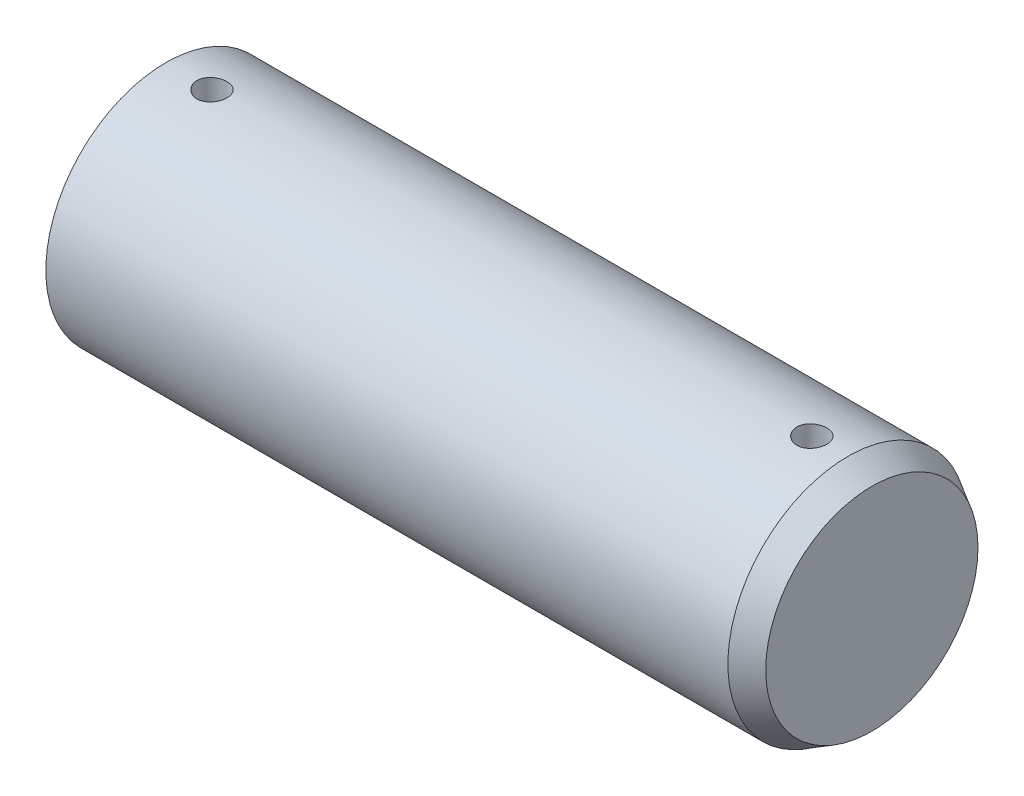
ISO-10303-21;
HEADER;
FILE_DESCRIPTION(('STEP AP214'),'2;1');
FILE_NAME('part.step','',(''),(''),'','','');
FILE_SCHEMA(('AUTOMOTIVE_DESIGN { 1 0 10303 214 1 1 1 1 }'));
ENDSEC;
DATA;
#1=APPLICATION_CONTEXT('core data for automotive mechanical design processes');
#2=APPLICATION_PROTOCOL_DEFINITION('international standard','automotive_design',2000,#1);
#3=PRODUCT_CONTEXT('',#1,'mechanical');
#4=PRODUCT('Part','Part','',(#3));
#5=PRODUCT_RELATED_PRODUCT_CATEGORY('part','',(#4));
#6=PRODUCT_DEFINITION_FORMATION('','',#4);
#7=PRODUCT_DEFINITION_CONTEXT('part definition',#1,'design');
#8=PRODUCT_DEFINITION('design','',#6,#7);
#9=PRODUCT_DEFINITION_SHAPE('','',#8);
#10=(LENGTH_UNIT() NAMED_UNIT(*) SI_UNIT(.MILLI.,.METRE.));
#11=(NAMED_UNIT(*) PLANE_ANGLE_UNIT() SI_UNIT($,.RADIAN.));
#12=(NAMED_UNIT(*) SI_UNIT($,.STERADIAN.) SOLID_ANGLE_UNIT());
#13=UNCERTAINTY_MEASURE_WITH_UNIT(LENGTH_MEASURE(1.E-05),#10,'distance_accuracy_value','');
#14=(GEOMETRIC_REPRESENTATION_CONTEXT(3) GLOBAL_UNCERTAINTY_ASSIGNED_CONTEXT((#13)) GLOBAL_UNIT_ASSIGNED_CONTEXT((#10,
#11,#12)) REPRESENTATION_CONTEXT('',''));
#15=CARTESIAN_POINT('',(0.,0.,0.));
#16=DIRECTION('',(0.,0.,1.));
#17=DIRECTION('',(1.,0.,0.));
#18=AXIS2_PLACEMENT_3D('',#15,#16,#17);
#19=CARTESIAN_POINT('',(76.2,0.,0.));
#20=DIRECTION('',(-1.,0.,0.));
#21=DIRECTION('',(0.,0.,1.));
#22=AXIS2_PLACEMENT_3D('',#19,#20,#21);
#23=CYLINDRICAL_SURFACE('',#22,12.7);
#24=CARTESIAN_POINT('',(69.85,-12.6003906189451,1.5875));
#25=CARTESIAN_POINT('',(69.9387960402078,-12.6003918944879,1.58749622481956));
#26=CARTESIAN_POINT('',(70.0276475777145,-12.6013393840053,1.58002471587852));
#27=CARTESIAN_POINT('',(70.2028778981319,-12.6050255327228,1.55033752271305));
#28=CARTESIAN_POINT('',(70.2892539986156,-12.6077660635828,1.52810643139297));
#29=CARTESIAN_POINT('',(70.4569710251437,-12.614723143474,1.46956569994448));
#30=CARTESIAN_POINT('',(70.5383153252453,-12.6189386905307,1.43326561504688));
#31=CARTESIAN_POINT('',(70.6937425669076,-12.6283696093514,1.34763776600275));
#32=CARTESIAN_POINT('',(70.7678267468568,-12.6335848101502,1.29831222898299));
#33=CARTESIAN_POINT('',(70.9070605269225,-12.6444601011988,1.18773794091791));
#34=CARTESIAN_POINT('',(70.9721636194725,-12.650122284808,1.12643082754043));
#35=CARTESIAN_POINT('',(71.0911854582763,-12.6612347287615,0.993759290526231));
#36=CARTESIAN_POINT('',(71.1451036481001,-12.6666849785516,0.922394366826847));
#37=CARTESIAN_POINT('',(71.2403919229865,-12.6767808732914,0.771340742479234));
#38=CARTESIAN_POINT('',(71.2817199236383,-12.6814237979272,0.691625296681301));
#39=CARTESIAN_POINT('',(71.3503851119625,-12.6893589046612,0.526317665965503));
#40=CARTESIAN_POINT('',(71.3777228188983,-12.6926511368908,0.440725699294172));
#41=CARTESIAN_POINT('',(71.4174924633923,-12.6974991712845,0.266570261721954));
#42=CARTESIAN_POINT('',(71.4300017158627,-12.6990639772082,0.178024700886242));
#43=CARTESIAN_POINT('',(71.4399989694982,-12.7003115927805,7.82324359532377E-05));
#44=CARTESIAN_POINT('',(71.4374875615898,-12.6999944764657,-0.0893226413916833));
#45=CARTESIAN_POINT('',(71.417576746249,-12.6975212633396,-0.265915945798842));
#46=CARTESIAN_POINT('',(71.4002604894643,-12.6953754375939,-0.353117915660431));
#47=CARTESIAN_POINT('',(71.35136150284,-12.6894974552338,-0.523368374079917));
#48=CARTESIAN_POINT('',(71.319778501784,-12.6857652684622,-0.606416783643694));
#49=CARTESIAN_POINT('',(71.2431541270823,-12.6771162370803,-0.766260097803534));
#50=CARTESIAN_POINT('',(71.1980767693413,-12.6721962319046,-0.843037574678723));
#51=CARTESIAN_POINT('',(71.0957694399928,-12.6617220035645,-0.987969482214607));
#52=CARTESIAN_POINT('',(71.0385389110374,-12.6561677513189,-1.05612351717302));
#53=CARTESIAN_POINT('',(70.91308409519,-12.6450018087743,-1.18236239954082));
#54=CARTESIAN_POINT('',(70.8447873426879,-12.63938998536,-1.24037524339746));
#55=CARTESIAN_POINT('',(70.6993877114431,-12.6287788568227,-1.34412536014694));
#56=CARTESIAN_POINT('',(70.6222848050983,-12.6237795536196,-1.38986259456129));
#57=CARTESIAN_POINT('',(70.4613973703179,-12.6149595465908,-1.46776730422504));
#58=CARTESIAN_POINT('',(70.3776100192297,-12.6111393440166,-1.49992901046258));
#59=CARTESIAN_POINT('',(70.2057654470104,-12.6051198398493,-1.54970585058724));
#60=CARTESIAN_POINT('',(70.1177084318739,-12.6029204601406,-1.56732168551776));
#61=CARTESIAN_POINT('',(69.9404600794301,-12.6004058937787,-1.58741137426197));
#62=CARTESIAN_POINT('',(69.8512803993386,-12.6000780982591,-1.58998655966891));
#63=CARTESIAN_POINT('',(69.6737608746624,-12.6013104661098,-1.5801892153014));
#64=CARTESIAN_POINT('',(69.5854210122176,-12.6028705892392,-1.56781700412973));
#65=CARTESIAN_POINT('',(69.412392440128,-12.6076915008733,-1.52856138648156));
#66=CARTESIAN_POINT('',(69.3276924243541,-12.6109465376111,-1.50172704717875));
#67=CARTESIAN_POINT('',(69.1639941616682,-12.6187858493146,-1.43435941163874));
#68=CARTESIAN_POINT('',(69.084996115202,-12.6233701709813,-1.39382563409908));
#69=CARTESIAN_POINT('',(68.9344858011787,-12.633381714093,-1.29996058406837));
#70=CARTESIAN_POINT('',(68.8630152675253,-12.6388132588805,-1.24656286093146));
#71=CARTESIAN_POINT('',(68.7300145882513,-12.649893671149,-1.12857962140428));
#72=CARTESIAN_POINT('',(68.6684848294638,-12.6555425470767,-1.06399366984018));
#73=CARTESIAN_POINT('',(68.5567563410426,-12.6664598631622,-0.925024677479658));
#74=CARTESIAN_POINT('',(68.5066241962852,-12.6717259513445,-0.850587892494311));
#75=CARTESIAN_POINT('',(68.4195747318025,-12.6812491677507,-0.694291589367927));
#76=CARTESIAN_POINT('',(68.3826571457146,-12.685506316311,-0.612432220883874));
#77=CARTESIAN_POINT('',(68.3231947053134,-12.6925215456477,-0.443835700553543));
#78=CARTESIAN_POINT('',(68.3006113690199,-12.6952836371169,-0.357112294734971));
#79=CARTESIAN_POINT('',(68.270333303341,-12.6990141922025,-0.181067746371499));
#80=CARTESIAN_POINT('',(68.2626379025695,-12.6999827367006,-0.0917467211531938));
#81=CARTESIAN_POINT('',(68.2623666993445,-12.7000166878868,0.0863074114233058));
#82=CARTESIAN_POINT('',(68.2696882250393,-12.6990950181158,0.175040377448859));
#83=CARTESIAN_POINT('',(68.2990255895286,-12.6954777913529,0.350004215822413));
#84=CARTESIAN_POINT('',(68.3210414181034,-12.6927822355947,0.436235089910508));
#85=CARTESIAN_POINT('',(68.379110202612,-12.6859187810964,0.603733516296948));
#86=CARTESIAN_POINT('',(68.415158241402,-12.6817513981589,0.685002795701329));
#87=CARTESIAN_POINT('',(68.5002575347758,-12.6724057422999,0.840354769086456));
#88=CARTESIAN_POINT('',(68.5493089439462,-12.6672274573608,0.914437377616401));
#89=CARTESIAN_POINT('',(68.6594024417386,-12.6563957814274,1.05383759765622));
#90=CARTESIAN_POINT('',(68.7205209238875,-12.6507395021211,1.11909465527478));
#91=CARTESIAN_POINT('',(68.8528550194583,-12.639612509736,1.23846661045028));
#92=CARTESIAN_POINT('',(68.9240730212067,-12.6341418409304,1.29257886504887));
#93=CARTESIAN_POINT('',(69.0748999009128,-12.6239829523563,1.38830382899769));
#94=CARTESIAN_POINT('',(69.1545401196088,-12.619297835727,1.42986746231088));
#95=CARTESIAN_POINT('',(69.3196840302777,-12.6112768990596,1.49897165809803));
#96=CARTESIAN_POINT('',(69.4051812295577,-12.6079396123271,1.52652747222998));
#97=CARTESIAN_POINT('',(69.5509340417726,-12.603802496306,1.56023684411112));
#98=CARTESIAN_POINT('',(69.6102703242264,-12.6025294146641,1.57044582469172));
#99=CARTESIAN_POINT('',(69.729729253729,-12.6008230471599,1.5840786555));
#100=CARTESIAN_POINT('',(69.7898518948081,-12.6003897549259,1.58750255720807));
#101=CARTESIAN_POINT('',(69.85,-12.6003906189451,1.5875));
#102=B_SPLINE_CURVE_WITH_KNOTS('',3,(#24,#25,#26,#27,#28,#29,#30,#31,#32,#33,#34,#35,#36,#37,
#38,#39,#40,#41,#42,#43,#44,#45,#46,#47,#48,#49,#50,#51,#52,#53,#54,#55,#56,#57,#58,#59,#60,#61,
#62,#63,#64,#65,#66,#67,#68,#69,#70,#71,#72,#73,#74,#75,#76,#77,#78,#79,#80,#81,#82,#83,#84,#85,
#86,#87,#88,#89,#90,#91,#92,#93,#94,#95,#96,#97,#98,#99,#100,#101),.UNSPECIFIED.,.T.,.F.,(4,2,2,
2,2,2,2,2,2,2,2,2,2,2,2,2,2,2,2,2,2,2,2,2,2,2,2,2,2,2,2,2,2,2,2,2,2,2,4),(0.,0.2661683890993,
0.532615061356762,0.798881087389064,1.06510161598638,1.33265276743657,1.60021722591538,
1.86866648202546,2.13710577365792,2.40413919057826,2.67116210223019,2.9366950723248,
3.20223309051587,3.46848559802129,3.73475031857881,4.00283487834883,4.27092027843335,
4.53911948879271,4.80730577244181,5.07368313306735,5.34005481597719,5.60552838945885,
5.87101129079527,6.1378961541051,6.40479140041705,6.67320792541638,6.94161903970139,
7.20930649058438,7.47698186955736,7.74283323343042,8.0086844124111,8.27444251600497,
8.54020377912297,8.8077048184568,9.07526922204292,9.3438668704257,9.61217144098581,
9.79246828416924,9.97276375938226),.UNSPECIFIED.);
#103=CARTESIAN_POINT('',(69.85,-12.6003906189451,1.5875));
#104=VERTEX_POINT('',#103);
#105=EDGE_CURVE('E12',#104,#104,#102,.T.);
#106=ORIENTED_EDGE('',*,*,#105,.T.);
#107=EDGE_LOOP('',(#106));
#108=FACE_BOUND('',#107,.T.);
#109=CARTESIAN_POINT('',(69.85,12.6003906189451,1.5875));
#110=CARTESIAN_POINT('',(69.7612039597922,12.6003918944879,1.58749622481956));
#111=CARTESIAN_POINT('',(69.6723524222855,12.6013393840053,1.58002471587852));
#112=CARTESIAN_POINT('',(69.4971221018681,12.6050255327228,1.55033752271305));
#113=CARTESIAN_POINT('',(69.4107460013844,12.6077660635828,1.52810643139297));
#114=CARTESIAN_POINT('',(69.2430289748563,12.614723143474,1.46956569994448));
#115=CARTESIAN_POINT('',(69.1616846747546,12.6189386905307,1.43326561504688));
#116=CARTESIAN_POINT('',(69.0062574330923,12.6283696093514,1.34763776600275));
#117=CARTESIAN_POINT('',(68.9321732531432,12.6335848101502,1.29831222898299));
#118=CARTESIAN_POINT('',(68.7929394730775,12.6444601011988,1.18773794091791));
#119=CARTESIAN_POINT('',(68.7278363805275,12.650122284808,1.12643082754043));
#120=CARTESIAN_POINT('',(68.6088145417237,12.6612347287615,0.993759290526231));
#121=CARTESIAN_POINT('',(68.5548963518999,12.6666849785516,0.922394366826847));
#122=CARTESIAN_POINT('',(68.4596080770135,12.6767808732914,0.771340742479234));
#123=CARTESIAN_POINT('',(68.4182800763617,12.6814237979272,0.691625296681301));
#124=CARTESIAN_POINT('',(68.3496148880375,12.6893589046612,0.526317665965504));
#125=CARTESIAN_POINT('',(68.3222771811017,12.6926511368908,0.440725699294172));
#126=CARTESIAN_POINT('',(68.2825075366076,12.6974991712845,0.266570261721954));
#127=CARTESIAN_POINT('',(68.2699982841373,12.6990639772082,0.178024700886242));
#128=CARTESIAN_POINT('',(68.2600010305018,12.7003115927805,7.8232435953319E-05));
#129=CARTESIAN_POINT('',(68.2625124384101,12.6999944764657,-0.0893226413916832));
#130=CARTESIAN_POINT('',(68.282423253751,12.6975212633396,-0.265915945798842));
#131=CARTESIAN_POINT('',(68.2997395105357,12.6953754375939,-0.353117915660432));
#132=CARTESIAN_POINT('',(68.34863849716,12.6894974552338,-0.523368374079917));
#133=CARTESIAN_POINT('',(68.3802214982159,12.6857652684622,-0.606416783643693));
#134=CARTESIAN_POINT('',(68.4568458729177,12.6771162370803,-0.766260097803536));
#135=CARTESIAN_POINT('',(68.5019232306587,12.6721962319046,-0.843037574678728));
#136=CARTESIAN_POINT('',(68.6042305600072,12.6617220035645,-0.987969482214612));
#137=CARTESIAN_POINT('',(68.6614610889625,12.6561677513189,-1.05612351717302));
#138=CARTESIAN_POINT('',(68.78691590481,12.6450018087743,-1.18236239954082));
#139=CARTESIAN_POINT('',(68.8552126573121,12.63938998536,-1.24037524339746));
#140=CARTESIAN_POINT('',(69.0006122885569,12.6287788568227,-1.34412536014694));
#141=CARTESIAN_POINT('',(69.0777151949017,12.6237795536196,-1.38986259456129));
#142=CARTESIAN_POINT('',(69.2386026296821,12.6149595465908,-1.46776730422504));
#143=CARTESIAN_POINT('',(69.3223899807703,12.6111393440166,-1.49992901046258));
#144=CARTESIAN_POINT('',(69.4942345529895,12.6051198398493,-1.54970585058724));
#145=CARTESIAN_POINT('',(69.5822915681261,12.6029204601406,-1.56732168551776));
#146=CARTESIAN_POINT('',(69.7595399205699,12.6004058937787,-1.58741137426197));
#147=CARTESIAN_POINT('',(69.8487196006614,12.6000780982591,-1.58998655966891));
#148=CARTESIAN_POINT('',(70.0262391253376,12.6013104661098,-1.5801892153014));
#149=CARTESIAN_POINT('',(70.1145789877824,12.6028705892392,-1.56781700412973));
#150=CARTESIAN_POINT('',(70.2876075598719,12.6076915008733,-1.52856138648156));
#151=CARTESIAN_POINT('',(70.3723075756459,12.6109465376111,-1.50172704717875));
#152=CARTESIAN_POINT('',(70.5360058383317,12.6187858493146,-1.43435941163874));
#153=CARTESIAN_POINT('',(70.615003884798,12.6233701709813,-1.39382563409908));
#154=CARTESIAN_POINT('',(70.7655141988213,12.633381714093,-1.29996058406837));
#155=CARTESIAN_POINT('',(70.8369847324747,12.6388132588805,-1.24656286093146));
#156=CARTESIAN_POINT('',(70.9699854117488,12.649893671149,-1.12857962140428));
#157=CARTESIAN_POINT('',(71.0315151705362,12.6555425470767,-1.06399366984018));
#158=CARTESIAN_POINT('',(71.1432436589573,12.6664598631622,-0.925024677479657));
#159=CARTESIAN_POINT('',(71.1933758037148,12.6717259513445,-0.85058789249431));
#160=CARTESIAN_POINT('',(71.2804252681975,12.6812491677507,-0.694291589367927));
#161=CARTESIAN_POINT('',(71.3173428542854,12.685506316311,-0.612432220883874));
#162=CARTESIAN_POINT('',(71.3768052946866,12.6925215456477,-0.443835700553543));
#163=CARTESIAN_POINT('',(71.3993886309801,12.6952836371169,-0.357112294734971));
#164=CARTESIAN_POINT('',(71.429666696659,12.6990141922025,-0.181067746371499));
#165=CARTESIAN_POINT('',(71.4373620974305,12.6999827367006,-0.0917467211531938));
#166=CARTESIAN_POINT('',(71.4376333006555,12.7000166878868,0.0863074114233058));
#167=CARTESIAN_POINT('',(71.4303117749606,12.6990950181158,0.175040377448859));
#168=CARTESIAN_POINT('',(71.4009744104714,12.6954777913529,0.350004215822413));
#169=CARTESIAN_POINT('',(71.3789585818965,12.6927822355947,0.436235089910508));
#170=CARTESIAN_POINT('',(71.3208897973879,12.6859187810964,0.603733516296948));
#171=CARTESIAN_POINT('',(71.284841758598,12.6817513981589,0.685002795701329));
#172=CARTESIAN_POINT('',(71.1997424652242,12.6724057422999,0.840354769086455));
#173=CARTESIAN_POINT('',(71.1506910560538,12.6672274573608,0.9144373776164));
#174=CARTESIAN_POINT('',(71.0405975582614,12.6563957814274,1.05383759765623));
#175=CARTESIAN_POINT('',(70.9794790761125,12.6507395021211,1.11909465527478));
#176=CARTESIAN_POINT('',(70.8471449805417,12.639612509736,1.23846661045029));
#177=CARTESIAN_POINT('',(70.7759269787933,12.6341418409304,1.29257886504887));
#178=CARTESIAN_POINT('',(70.6251000990872,12.6239829523563,1.38830382899768));
#179=CARTESIAN_POINT('',(70.5454598803912,12.619297835727,1.42986746231088));
#180=CARTESIAN_POINT('',(70.3803159697223,12.6112768990596,1.49897165809803));
#181=CARTESIAN_POINT('',(70.2948187704423,12.6079396123271,1.52652747222998));
#182=CARTESIAN_POINT('',(70.1490659582274,12.603802496306,1.56023684411111));
#183=CARTESIAN_POINT('',(70.0897296757736,12.6025294146641,1.57044582469172));
#184=CARTESIAN_POINT('',(69.970270746271,12.6008230471599,1.5840786555));
#185=CARTESIAN_POINT('',(69.9101481051919,12.6003897549259,1.58750255720807));
#186=CARTESIAN_POINT('',(69.85,12.6003906189451,1.5875));
#187=B_SPLINE_CURVE_WITH_KNOTS('',3,(#109,#110,#111,#112,#113,#114,#115,#116,#117,#118,#119,
#120,#121,#122,#123,#124,#125,#126,#127,#128,#129,#130,#131,#132,#133,#134,#135,#136,#137,#138,
#139,#140,#141,#142,#143,#144,#145,#146,#147,#148,#149,#150,#151,#152,#153,#154,#155,#156,#157,
#158,#159,#160,#161,#162,#163,#164,#165,#166,#167,#168,#169,#170,#171,#172,#173,#174,#175,#176,
#177,#178,#179,#180,#181,#182,#183,#184,#185,#186),.UNSPECIFIED.,.T.,.F.,(4,2,2,2,2,2,2,2,2,2,2,
2,2,2,2,2,2,2,2,2,2,2,2,2,2,2,2,2,2,2,2,2,2,2,2,2,2,2,4),(0.,0.2661683890993,0.532615061356762,
0.798881087389064,1.06510161598638,1.33265276743657,1.60021722591538,1.86866648202546,
2.13710577365792,2.40413919057826,2.67116210223019,2.9366950723248,3.20223309051587,
3.4684855980213,3.73475031857881,4.00283487834883,4.27092027843335,4.53911948879271,
4.80730577244181,5.07368313306739,5.34005481597719,5.60552838945885,5.87101129079527,
6.13789615410512,6.40479140041705,6.67320792541638,6.94161903970139,7.20930649058438,
7.47698186955736,7.74283323343042,8.0086844124111,8.27444251600497,8.54020377912297,
8.80770481845681,9.07526922204292,9.3438668704257,9.61217144098581,9.79246828416922,
9.97276375938226),.UNSPECIFIED.);
#188=CARTESIAN_POINT('',(69.85,12.6003906189451,1.5875));
#189=VERTEX_POINT('',#188);
#190=EDGE_CURVE('E56',#189,#189,#187,.T.);
#191=ORIENTED_EDGE('',*,*,#190,.T.);
#192=EDGE_LOOP('',(#191));
#193=FACE_BOUND('',#192,.T.);
#194=CARTESIAN_POINT('',(6.35,-12.6003906189451,1.5875));
#195=CARTESIAN_POINT('',(6.43879604020781,-12.6003918944879,1.58749622481956));
#196=CARTESIAN_POINT('',(6.52764757771456,-12.6013393840053,1.58002471587852));
#197=CARTESIAN_POINT('',(6.70287789813193,-12.6050255327228,1.55033752271305));
#198=CARTESIAN_POINT('',(6.78925399861562,-12.6077660635828,1.52810643139297));
#199=CARTESIAN_POINT('',(6.95697102514368,-12.614723143474,1.46956569994448));
#200=CARTESIAN_POINT('',(7.03831532524535,-12.6189386905307,1.43326561504688));
#201=CARTESIAN_POINT('',(7.19374256690766,-12.6283696093514,1.34763776600275));
#202=CARTESIAN_POINT('',(7.26782674685684,-12.6335848101502,1.29831222898299));
#203=CARTESIAN_POINT('',(7.40706052692255,-12.6444601011988,1.18773794091791));
#204=CARTESIAN_POINT('',(7.47216361947249,-12.650122284808,1.12643082754043));
#205=CARTESIAN_POINT('',(7.59118545827631,-12.6612347287615,0.99375929052623));
#206=CARTESIAN_POINT('',(7.64510364810013,-12.6666849785516,0.92239436682685));
#207=CARTESIAN_POINT('',(7.74039192298654,-12.6767808732914,0.771340742479241));
#208=CARTESIAN_POINT('',(7.78171992363829,-12.6814237979272,0.691625296681306));
#209=CARTESIAN_POINT('',(7.85038511196252,-12.6893589046612,0.526317665965506));
#210=CARTESIAN_POINT('',(7.87772281889834,-12.6926511368908,0.440725699294174));
#211=CARTESIAN_POINT('',(7.91749246339236,-12.6974991712845,0.266570261721955));
#212=CARTESIAN_POINT('',(7.93000171586268,-12.6990639772082,0.178024700886244));
#213=CARTESIAN_POINT('',(7.93999896949821,-12.7003115927805,7.82324359560024E-05));
#214=CARTESIAN_POINT('',(7.93748756158987,-12.6999944764657,-0.0893226413916808));
#215=CARTESIAN_POINT('',(7.91757674624904,-12.6975212633396,-0.265915945798839));
#216=CARTESIAN_POINT('',(7.90026048946433,-12.6953754375939,-0.353117915660429));
#217=CARTESIAN_POINT('',(7.85136150283999,-12.6894974552338,-0.523368374079915));
#218=CARTESIAN_POINT('',(7.81977850178407,-12.6857652684622,-0.606416783643692));
#219=CARTESIAN_POINT('',(7.7431541270823,-12.6771162370803,-0.766260097803537));
#220=CARTESIAN_POINT('',(7.69807676934134,-12.6721962319046,-0.843037574678731));
#221=CARTESIAN_POINT('',(7.59576943999282,-12.6617220035645,-0.987969482214614));
#222=CARTESIAN_POINT('',(7.53853891103746,-12.6561677513189,-1.05612351717302));
#223=CARTESIAN_POINT('',(7.41308409519003,-12.6450018087743,-1.18236239954082));
#224=CARTESIAN_POINT('',(7.34478734268787,-12.63938998536,-1.24037524339746));
#225=CARTESIAN_POINT('',(7.19938771144314,-12.6287788568227,-1.34412536014694));
#226=CARTESIAN_POINT('',(7.12228480509833,-12.6237795536196,-1.38986259456129));
#227=CARTESIAN_POINT('',(6.96139737031792,-12.6149595465908,-1.46776730422504));
#228=CARTESIAN_POINT('',(6.87761001922972,-12.6111393440166,-1.49992901046258));
#229=CARTESIAN_POINT('',(6.70576544701046,-12.6051198398493,-1.54970585058724));
#230=CARTESIAN_POINT('',(6.61770843187396,-12.6029204601406,-1.56732168551776));
#231=CARTESIAN_POINT('',(6.44046007943015,-12.6004058937787,-1.58741137426197));
#232=CARTESIAN_POINT('',(6.35128039933862,-12.6000780982591,-1.58998655966891));
#233=CARTESIAN_POINT('',(6.17376087466246,-12.6013104661098,-1.58018921530141));
#234=CARTESIAN_POINT('',(6.08542101221763,-12.6028705892392,-1.56781700412973));
#235=CARTESIAN_POINT('',(5.91239244012806,-12.6076915008733,-1.52856138648156));
#236=CARTESIAN_POINT('',(5.82769242435409,-12.6109465376111,-1.50172704717875));
#237=CARTESIAN_POINT('',(5.66399416166825,-12.6187858493146,-1.43435941163874));
#238=CARTESIAN_POINT('',(5.58499611520205,-12.6233701709813,-1.39382563409908));
#239=CARTESIAN_POINT('',(5.43448580117875,-12.633381714093,-1.29996058406838));
#240=CARTESIAN_POINT('',(5.36301526752534,-12.6388132588805,-1.24656286093146));
#241=CARTESIAN_POINT('',(5.23001458825126,-12.649893671149,-1.12857962140429));
#242=CARTESIAN_POINT('',(5.16848482946383,-12.6555425470767,-1.06399366984018));
#243=CARTESIAN_POINT('',(5.05675634104265,-12.6664598631622,-0.925024677479661));
#244=CARTESIAN_POINT('',(5.00662419628518,-12.6717259513445,-0.850587892494315));
#245=CARTESIAN_POINT('',(4.91957473180254,-12.6812491677507,-0.694291589367935));
#246=CARTESIAN_POINT('',(4.88265714571458,-12.685506316311,-0.612432220883883));
#247=CARTESIAN_POINT('',(4.8231947053134,-12.6925215456477,-0.443835700553552));
#248=CARTESIAN_POINT('',(4.80061136901993,-12.6952836371169,-0.357112294734978));
#249=CARTESIAN_POINT('',(4.77033330334101,-12.6990141922025,-0.181067746371503));
#250=CARTESIAN_POINT('',(4.76263790256949,-12.6999827367006,-0.0917467211531964));
#251=CARTESIAN_POINT('',(4.76236669934448,-12.7000166878868,0.0863074114233044));
#252=CARTESIAN_POINT('',(4.76968822503934,-12.6990950181158,0.175040377448858));
#253=CARTESIAN_POINT('',(4.79902558952858,-12.6954777913529,0.350004215822411));
#254=CARTESIAN_POINT('',(4.82104141810347,-12.6927822355947,0.436235089910506));
#255=CARTESIAN_POINT('',(4.87911020261206,-12.6859187810964,0.603733516296947));
#256=CARTESIAN_POINT('',(4.915158241402,-12.6817513981589,0.68500279570133));
#257=CARTESIAN_POINT('',(5.0002575347758,-12.6724057422999,0.840354769086457));
#258=CARTESIAN_POINT('',(5.04930894394618,-12.6672274573608,0.914437377616401));
#259=CARTESIAN_POINT('',(5.1594024417386,-12.6563957814274,1.05383759765622));
#260=CARTESIAN_POINT('',(5.22052092388752,-12.6507395021211,1.11909465527478));
#261=CARTESIAN_POINT('',(5.35285501945833,-12.639612509736,1.23846661045029));
#262=CARTESIAN_POINT('',(5.42407302120673,-12.6341418409304,1.29257886504887));
#263=CARTESIAN_POINT('',(5.57489990091283,-12.6239829523563,1.38830382899768));
#264=CARTESIAN_POINT('',(5.65454011960878,-12.619297835727,1.42986746231088));
#265=CARTESIAN_POINT('',(5.81968403027768,-12.6112768990596,1.49897165809803));
#266=CARTESIAN_POINT('',(5.90518122955766,-12.6079396123271,1.52652747222998));
#267=CARTESIAN_POINT('',(6.05093404177265,-12.603802496306,1.56023684411112));
#268=CARTESIAN_POINT('',(6.11027032422636,-12.6025294146641,1.57044582469172));
#269=CARTESIAN_POINT('',(6.229729253729,-12.6008230471599,1.5840786555));
#270=CARTESIAN_POINT('',(6.28985189480811,-12.6003897549259,1.58750255720807));
#271=CARTESIAN_POINT('',(6.35,-12.6003906189451,1.5875));
#272=B_SPLINE_CURVE_WITH_KNOTS('',3,(#194,#195,#196,#197,#198,#199,#200,#201,#202,#203,#204,
#205,#206,#207,#208,#209,#210,#211,#212,#213,#214,#215,#216,#217,#218,#219,#220,#221,#222,#223,
#224,#225,#226,#227,#228,#229,#230,#231,#232,#233,#234,#235,#236,#237,#238,#239,#240,#241,#242,
#243,#244,#245,#246,#247,#248,#249,#250,#251,#252,#253,#254,#255,#256,#257,#258,#259,#260,#261,
#262,#263,#264,#265,#266,#267,#268,#269,#270,#271),.UNSPECIFIED.,.T.,.F.,(4,2,2,2,2,2,2,2,2,2,2,
2,2,2,2,2,2,2,2,2,2,2,2,2,2,2,2,2,2,2,2,2,2,2,2,2,2,2,4),(0.,0.266168389099317,
0.532615061356763,0.798881087389063,1.06510161598639,1.33265276743657,1.60021722591538,
1.86866648202546,2.13710577365792,2.40413919057826,2.67116210223019,2.9366950723248,
3.20223309051587,3.46848559802131,3.73475031857882,4.00283487834884,4.27092027843335,
4.53911948879271,4.8073057724418,5.07368313306736,5.34005481597719,5.60552838945886,
5.87101129079527,6.13789615410511,6.40479140041706,6.67320792541638,6.94161903970138,
7.20930649058438,7.47698186955737,7.74283323343043,8.00868441241112,8.27444251600498,
8.54020377912298,8.80770481845682,9.07526922204292,9.34386687042571,9.61217144098581,
9.79246828416924,9.97276375938227),.UNSPECIFIED.);
#273=CARTESIAN_POINT('',(6.35,-12.6003906189451,1.5875));
#274=VERTEX_POINT('',#273);
#275=EDGE_CURVE('E60',#274,#274,#272,.T.);
#276=ORIENTED_EDGE('',*,*,#275,.T.);
#277=EDGE_LOOP('',(#276));
#278=FACE_BOUND('',#277,.T.);
#279=CARTESIAN_POINT('',(6.35,12.6003906189451,1.5875));
#280=CARTESIAN_POINT('',(6.26120395979219,12.6003918944879,1.58749622481956));
#281=CARTESIAN_POINT('',(6.17235242228544,12.6013393840053,1.58002471587852));
#282=CARTESIAN_POINT('',(5.99712210186807,12.6050255327228,1.55033752271305));
#283=CARTESIAN_POINT('',(5.91074600138438,12.6077660635828,1.52810643139297));
#284=CARTESIAN_POINT('',(5.74302897485632,12.614723143474,1.46956569994448));
#285=CARTESIAN_POINT('',(5.66168467475465,12.6189386905307,1.43326561504688));
#286=CARTESIAN_POINT('',(5.50625743309235,12.6283696093514,1.34763776600275));
#287=CARTESIAN_POINT('',(5.43217325314316,12.6335848101502,1.29831222898299));
#288=CARTESIAN_POINT('',(5.29293947307745,12.6444601011988,1.18773794091791));
#289=CARTESIAN_POINT('',(5.22783638052751,12.650122284808,1.12643082754043));
#290=CARTESIAN_POINT('',(5.10881454172369,12.6612347287615,0.99375929052623));
#291=CARTESIAN_POINT('',(5.05489635189987,12.6666849785516,0.922394366826851));
#292=CARTESIAN_POINT('',(4.95960807701346,12.6767808732914,0.771340742479241));
#293=CARTESIAN_POINT('',(4.91828007636172,12.6814237979272,0.691625296681307));
#294=CARTESIAN_POINT('',(4.84961488803749,12.6893589046612,0.526317665965507));
#295=CARTESIAN_POINT('',(4.82227718110166,12.6926511368908,0.440725699294174));
#296=CARTESIAN_POINT('',(4.78250753660764,12.6974991712845,0.266570261721956));
#297=CARTESIAN_POINT('',(4.76999828413733,12.6990639772082,0.178024700886245));
#298=CARTESIAN_POINT('',(4.7600010305018,12.7003115927805,7.82324359564768E-05));
#299=CARTESIAN_POINT('',(4.76251243841014,12.6999944764657,-0.0893226413916804));
#300=CARTESIAN_POINT('',(4.78242325375097,12.6975212633396,-0.265915945798839));
#301=CARTESIAN_POINT('',(4.79973951053567,12.6953754375939,-0.353117915660429));
#302=CARTESIAN_POINT('',(4.84863849716001,12.6894974552338,-0.523368374079915));
#303=CARTESIAN_POINT('',(4.88022149821594,12.6857652684622,-0.606416783643692));
#304=CARTESIAN_POINT('',(4.9568458729177,12.6771162370803,-0.766260097803537));
#305=CARTESIAN_POINT('',(5.00192323065867,12.6721962319046,-0.843037574678731));
#306=CARTESIAN_POINT('',(5.10423056000718,12.6617220035645,-0.987969482214614));
#307=CARTESIAN_POINT('',(5.16146108896255,12.6561677513189,-1.05612351717302));
#308=CARTESIAN_POINT('',(5.28691590480997,12.6450018087743,-1.18236239954082));
#309=CARTESIAN_POINT('',(5.35521265731213,12.63938998536,-1.24037524339746));
#310=CARTESIAN_POINT('',(5.50061228855686,12.6287788568227,-1.34412536014694));
#311=CARTESIAN_POINT('',(5.57771519490167,12.6237795536196,-1.38986259456129));
#312=CARTESIAN_POINT('',(5.73860262968208,12.6149595465908,-1.46776730422504));
#313=CARTESIAN_POINT('',(5.82238998077028,12.6111393440166,-1.49992901046258));
#314=CARTESIAN_POINT('',(5.99423455298954,12.6051198398493,-1.54970585058724));
#315=CARTESIAN_POINT('',(6.08229156812604,12.6029204601406,-1.56732168551776));
#316=CARTESIAN_POINT('',(6.25953992056985,12.6004058937787,-1.58741137426197));
#317=CARTESIAN_POINT('',(6.34871960066139,12.6000780982591,-1.58998655966891));
#318=CARTESIAN_POINT('',(6.52623912533754,12.6013104661098,-1.58018921530141));
#319=CARTESIAN_POINT('',(6.61457898778237,12.6028705892392,-1.56781700412973));
#320=CARTESIAN_POINT('',(6.78760755987194,12.6076915008733,-1.52856138648156));
#321=CARTESIAN_POINT('',(6.87230757564591,12.6109465376111,-1.50172704717875));
#322=CARTESIAN_POINT('',(7.03600583833176,12.6187858493146,-1.43435941163874));
#323=CARTESIAN_POINT('',(7.11500388479795,12.6233701709813,-1.39382563409908));
#324=CARTESIAN_POINT('',(7.26551419882125,12.633381714093,-1.29996058406838));
#325=CARTESIAN_POINT('',(7.33698473247466,12.6388132588805,-1.24656286093146));
#326=CARTESIAN_POINT('',(7.46998541174875,12.649893671149,-1.12857962140429));
#327=CARTESIAN_POINT('',(7.53151517053617,12.6555425470767,-1.06399366984018));
#328=CARTESIAN_POINT('',(7.64324365895735,12.6664598631622,-0.925024677479662));
#329=CARTESIAN_POINT('',(7.69337580371482,12.6717259513445,-0.850587892494316));
#330=CARTESIAN_POINT('',(7.78042526819746,12.6812491677507,-0.694291589367936));
#331=CARTESIAN_POINT('',(7.81734285428542,12.685506316311,-0.612432220883884));
#332=CARTESIAN_POINT('',(7.8768052946866,12.6925215456477,-0.443835700553553));
#333=CARTESIAN_POINT('',(7.89938863098008,12.6952836371169,-0.357112294734978));
#334=CARTESIAN_POINT('',(7.92966669665899,12.6990141922025,-0.181067746371503));
#335=CARTESIAN_POINT('',(7.93736209743052,12.6999827367006,-0.0917467211531964));
#336=CARTESIAN_POINT('',(7.93763330065552,12.7000166878868,0.0863074114233045));
#337=CARTESIAN_POINT('',(7.93031177496066,12.6990950181158,0.175040377448858));
#338=CARTESIAN_POINT('',(7.90097441047142,12.6954777913529,0.350004215822411));
#339=CARTESIAN_POINT('',(7.87895858189654,12.6927822355947,0.436235089910506));
#340=CARTESIAN_POINT('',(7.82088979738795,12.6859187810964,0.603733516296947));
#341=CARTESIAN_POINT('',(7.784841758598,12.6817513981589,0.685002795701329));
#342=CARTESIAN_POINT('',(7.6997424652242,12.6724057422999,0.840354769086457));
#343=CARTESIAN_POINT('',(7.65069105605383,12.6672274573608,0.9144373776164));
#344=CARTESIAN_POINT('',(7.5405975582614,12.6563957814274,1.05383759765622));
#345=CARTESIAN_POINT('',(7.47947907611248,12.6507395021211,1.11909465527478));
#346=CARTESIAN_POINT('',(7.34714498054167,12.639612509736,1.23846661045029));
#347=CARTESIAN_POINT('',(7.27592697879328,12.6341418409304,1.29257886504887));
#348=CARTESIAN_POINT('',(7.12510009908717,12.6239829523563,1.38830382899768));
#349=CARTESIAN_POINT('',(7.04545988039122,12.619297835727,1.42986746231088));
#350=CARTESIAN_POINT('',(6.88031596972233,12.6112768990596,1.49897165809803));
#351=CARTESIAN_POINT('',(6.79481877044234,12.6079396123271,1.52652747222998));
#352=CARTESIAN_POINT('',(6.64906595822736,12.603802496306,1.56023684411112));
#353=CARTESIAN_POINT('',(6.58972967577364,12.6025294146641,1.57044582469172));
#354=CARTESIAN_POINT('',(6.470270746271,12.6008230471599,1.5840786555));
#355=CARTESIAN_POINT('',(6.4101481051919,12.6003897549259,1.58750255720807));
#356=CARTESIAN_POINT('',(6.35,12.6003906189451,1.5875));
#357=B_SPLINE_CURVE_WITH_KNOTS('',3,(#279,#280,#281,#282,#283,#284,#285,#286,#287,#288,#289,
#290,#291,#292,#293,#294,#295,#296,#297,#298,#299,#300,#301,#302,#303,#304,#305,#306,#307,#308,
#309,#310,#311,#312,#313,#314,#315,#316,#317,#318,#319,#320,#321,#322,#323,#324,#325,#326,#327,
#328,#329,#330,#331,#332,#333,#334,#335,#336,#337,#338,#339,#340,#341,#342,#343,#344,#345,#346,
#347,#348,#349,#350,#351,#352,#353,#354,#355,#356),.UNSPECIFIED.,.T.,.F.,(4,2,2,2,2,2,2,2,2,2,2,
2,2,2,2,2,2,2,2,2,2,2,2,2,2,2,2,2,2,2,2,2,2,2,2,2,2,2,4),(0.,0.266168389099317,
0.532615061356763,0.798881087389064,1.06510161598639,1.33265276743657,1.60021722591538,
1.86866648202546,2.13710577365792,2.40413919057826,2.67116210223019,2.9366950723248,
3.20223309051586,3.46848559802131,3.73475031857882,4.00283487834884,4.27092027843335,
4.53911948879271,4.8073057724418,5.07368313306736,5.34005481597719,5.60552838945886,
5.87101129079527,6.13789615410511,6.40479140041705,6.67320792541638,6.94161903970138,
7.20930649058438,7.47698186955736,7.74283323343043,8.00868441241111,8.27444251600498,
8.54020377912298,8.80770481845682,9.07526922204292,9.34386687042571,9.61217144098581,
9.79246828416924,9.97276375938227),.UNSPECIFIED.);
#358=CARTESIAN_POINT('',(6.35,12.6003906189451,1.5875));
#359=VERTEX_POINT('',#358);
#360=EDGE_CURVE('E64',#359,#359,#357,.T.);
#361=ORIENTED_EDGE('',*,*,#360,.T.);
#362=EDGE_LOOP('',(#361));
#363=FACE_BOUND('',#362,.T.);
#364=CARTESIAN_POINT('',(73.6600000000001,0.,0.));
#365=DIRECTION('',(1.,0.,0.));
#366=DIRECTION('',(0.,0.,-1.));
#367=AXIS2_PLACEMENT_3D('',#364,#365,#366);
#368=CIRCLE('',#367,12.7);
#369=CARTESIAN_POINT('',(73.6600000000001,0.,-12.7));
#370=VERTEX_POINT('',#369);
#371=EDGE_CURVE('E96',#370,#370,#368,.F.);
#372=ORIENTED_EDGE('',*,*,#371,.T.);
#373=EDGE_LOOP('',(#372));
#374=FACE_BOUND('',#373,.T.);
#375=CARTESIAN_POINT('',(1.46646968374167,0.,0.));
#376=DIRECTION('',(1.,0.,0.));
#377=DIRECTION('',(0.,0.,-1.));
#378=AXIS2_PLACEMENT_3D('',#375,#376,#377);
#379=CIRCLE('',#378,12.7);
#380=CARTESIAN_POINT('',(1.46646968374167,0.,-12.7));
#381=VERTEX_POINT('',#380);
#382=EDGE_CURVE('E99',#381,#381,#379,.T.);
#383=ORIENTED_EDGE('',*,*,#382,.T.);
#384=EDGE_LOOP('',(#383));
#385=FACE_BOUND('',#384,.T.);
#386=ADVANCED_FACE('F44',(#108,#193,#278,#363,#374,#385),#23,.T.);
#387=CARTESIAN_POINT('',(76.2,0.,0.));
#388=DIRECTION('',(1.,0.,0.));
#389=DIRECTION('',(0.,0.,-1.));
#390=AXIS2_PLACEMENT_3D('',#387,#388,#389);
#391=PLANE('',#390);
#392=CARTESIAN_POINT('',(76.2,0.,0.));
#393=DIRECTION('',(1.,0.,0.));
#394=DIRECTION('',(0.,0.,-1.));
#395=AXIS2_PLACEMENT_3D('',#392,#393,#394);
#396=CIRCLE('',#395,11.2335303162584);
#397=CARTESIAN_POINT('',(76.2,0.,-11.2335303162584));
#398=VERTEX_POINT('',#397);
#399=EDGE_CURVE('E102',#398,#398,#396,.T.);
#400=ORIENTED_EDGE('',*,*,#399,.T.);
#401=EDGE_LOOP('',(#400));
#402=FACE_BOUND('',#401,.T.);
#403=ADVANCED_FACE('F86',(#402),#391,.T.);
#404=CARTESIAN_POINT('',(0.,0.,0.));
#405=DIRECTION('',(1.,0.,0.));
#406=DIRECTION('',(0.,0.,-1.));
#407=AXIS2_PLACEMENT_3D('',#404,#405,#406);
#408=PLANE('',#407);
#409=CARTESIAN_POINT('',(0.,0.,0.));
#410=DIRECTION('',(1.,0.,0.));
#411=DIRECTION('',(0.,0.,-1.));
#412=AXIS2_PLACEMENT_3D('',#409,#410,#411);
#413=CIRCLE('',#412,10.16);
#414=CARTESIAN_POINT('',(0.,0.,-10.16));
#415=VERTEX_POINT('',#414);
#416=EDGE_CURVE('E93',#415,#415,#413,.F.);
#417=ORIENTED_EDGE('',*,*,#416,.T.);
#418=EDGE_LOOP('',(#417));
#419=FACE_BOUND('',#418,.T.);
#420=ADVANCED_FACE('F109',(#419),#408,.F.);
#421=CARTESIAN_POINT('',(76.2,0.,0.));
#422=DIRECTION('',(-1.,0.,0.));
#423=DIRECTION('',(0.,0.,1.));
#424=AXIS2_PLACEMENT_3D('',#421,#422,#423);
#425=CONICAL_SURFACE('',#424,11.2335303162584,0.523598775598297);
#426=ORIENTED_EDGE('',*,*,#371,.F.);
#427=EDGE_LOOP('',(#426));
#428=FACE_BOUND('',#427,.T.);
#429=ORIENTED_EDGE('',*,*,#399,.F.);
#430=EDGE_LOOP('',(#429));
#431=FACE_BOUND('',#430,.T.);
#432=ADVANCED_FACE('F107',(#428,#431),#425,.T.);
#433=CARTESIAN_POINT('',(1.46646968374167,0.,0.));
#434=DIRECTION('',(1.,0.,0.));
#435=DIRECTION('',(0.,0.,-1.));
#436=AXIS2_PLACEMENT_3D('',#433,#434,#435);
#437=CONICAL_SURFACE('',#436,12.7,1.0471975511966);
#438=ORIENTED_EDGE('',*,*,#416,.F.);
#439=EDGE_LOOP('',(#438));
#440=FACE_BOUND('',#439,.T.);
#441=ORIENTED_EDGE('',*,*,#382,.F.);
#442=EDGE_LOOP('',(#441));
#443=FACE_BOUND('',#442,.T.);
#444=ADVANCED_FACE('F46',(#440,#443),#437,.T.);
#445=CARTESIAN_POINT('',(6.35,-12.7,0.));
#446=DIRECTION('',(0.,1.,0.));
#447=DIRECTION('',(0.,0.,1.));
#448=AXIS2_PLACEMENT_3D('',#445,#446,#447);
#449=CYLINDRICAL_SURFACE('',#448,1.5875);
#450=ORIENTED_EDGE('',*,*,#360,.F.);
#451=EDGE_LOOP('',(#450));
#452=FACE_BOUND('',#451,.T.);
#453=ORIENTED_EDGE('',*,*,#275,.F.);
#454=EDGE_LOOP('',(#453));
#455=FACE_BOUND('',#454,.T.);
#456=ADVANCED_FACE('F79',(#452,#455),#449,.F.);
#457=CARTESIAN_POINT('',(69.85,-12.7,0.));
#458=DIRECTION('',(0.,1.,0.));
#459=DIRECTION('',(0.,0.,1.));
#460=AXIS2_PLACEMENT_3D('',#457,#458,#459);
#461=CYLINDRICAL_SURFACE('',#460,1.5875);
#462=ORIENTED_EDGE('',*,*,#190,.F.);
#463=EDGE_LOOP('',(#462));
#464=FACE_BOUND('',#463,.T.);
#465=ORIENTED_EDGE('',*,*,#105,.F.);
#466=EDGE_LOOP('',(#465));
#467=FACE_BOUND('',#466,.T.);
#468=ADVANCED_FACE('F76',(#464,#467),#461,.F.);
#469=CLOSED_SHELL('',(#386,#403,#420,#432,#444,#456,#468));
#470=MANIFOLD_SOLID_BREP('B2',#469);
#471=ADVANCED_BREP_SHAPE_REPRESENTATION('',(#18,#470),#14);
#472=SHAPE_DEFINITION_REPRESENTATION(#9,#471);
ENDSEC;
END-ISO-10303-21;
